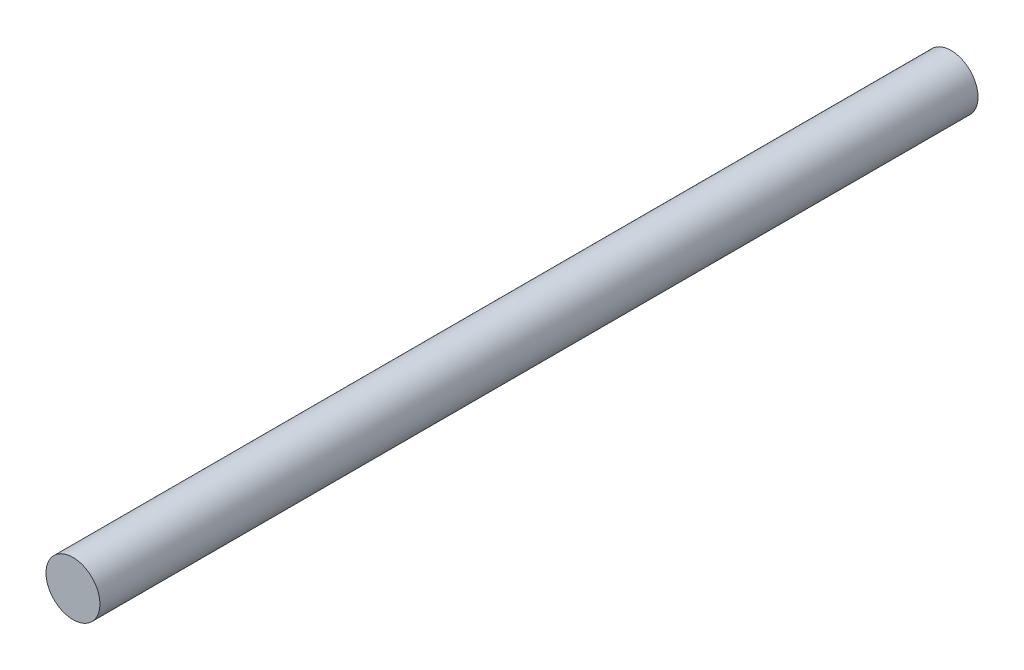
ISO-10303-21;
HEADER;
FILE_DESCRIPTION(('STEP AP214'),'2;1');
FILE_NAME('part.step','',(''),(''),'','','');
FILE_SCHEMA(('AUTOMOTIVE_DESIGN { 1 0 10303 214 1 1 1 1 }'));
ENDSEC;
DATA;
#1=APPLICATION_CONTEXT('core data for automotive mechanical design processes');
#2=APPLICATION_PROTOCOL_DEFINITION('international standard','automotive_design',2000,#1);
#3=PRODUCT_CONTEXT('',#1,'mechanical');
#4=PRODUCT('Part','Part','',(#3));
#5=PRODUCT_RELATED_PRODUCT_CATEGORY('part','',(#4));
#6=PRODUCT_DEFINITION_FORMATION('','',#4);
#7=PRODUCT_DEFINITION_CONTEXT('part definition',#1,'design');
#8=PRODUCT_DEFINITION('design','',#6,#7);
#9=PRODUCT_DEFINITION_SHAPE('','',#8);
#10=(LENGTH_UNIT() NAMED_UNIT(*) SI_UNIT(.MILLI.,.METRE.));
#11=(NAMED_UNIT(*) PLANE_ANGLE_UNIT() SI_UNIT($,.RADIAN.));
#12=(NAMED_UNIT(*) SI_UNIT($,.STERADIAN.) SOLID_ANGLE_UNIT());
#13=UNCERTAINTY_MEASURE_WITH_UNIT(LENGTH_MEASURE(1.E-05),#10,'distance_accuracy_value','');
#14=(GEOMETRIC_REPRESENTATION_CONTEXT(3) GLOBAL_UNCERTAINTY_ASSIGNED_CONTEXT((#13)) GLOBAL_UNIT_ASSIGNED_CONTEXT((#10,
#11,#12)) REPRESENTATION_CONTEXT('',''));
#15=CARTESIAN_POINT('',(0.,0.,0.));
#16=DIRECTION('',(0.,0.,1.));
#17=DIRECTION('',(1.,0.,0.));
#18=AXIS2_PLACEMENT_3D('',#15,#16,#17);
#19=CARTESIAN_POINT('',(0.,0.,114.));
#20=DIRECTION('',(0.,0.,-1.));
#21=DIRECTION('',(-1.,0.,0.));
#22=AXIS2_PLACEMENT_3D('',#19,#20,#21);
#23=CYLINDRICAL_SURFACE('',#22,3.5);
#24=CARTESIAN_POINT('',(0.,0.,114.));
#25=DIRECTION('',(0.,0.,1.));
#26=DIRECTION('',(1.,0.,0.));
#27=AXIS2_PLACEMENT_3D('',#24,#25,#26);
#28=CIRCLE('',#27,3.5);
#29=CARTESIAN_POINT('',(-3.5,0.,114.));
#30=VERTEX_POINT('',#29);
#31=EDGE_CURVE('E10',#30,#30,#28,.T.);
#32=CARTESIAN_POINT('',(0.,0.,0.));
#33=DIRECTION('',(0.,0.,1.));
#34=DIRECTION('',(1.,0.,0.));
#35=AXIS2_PLACEMENT_3D('',#32,#33,#34);
#36=CIRCLE('',#35,3.5);
#37=CARTESIAN_POINT('',(-3.5,0.,0.));
#38=VERTEX_POINT('',#37);
#39=EDGE_CURVE('E33',#38,#38,#36,.T.);
#40=CARTESIAN_POINT('',(-3.5,0.,114.));
#41=CARTESIAN_POINT('',(-3.5,0.,112.8125));
#42=CARTESIAN_POINT('',(-3.5,0.,111.625));
#43=CARTESIAN_POINT('',(-3.5,0.,109.25));
#44=CARTESIAN_POINT('',(-3.5,0.,108.0625));
#45=CARTESIAN_POINT('',(-3.5,0.,105.6875));
#46=CARTESIAN_POINT('',(-3.5,0.,104.5));
#47=CARTESIAN_POINT('',(-3.5,0.,102.125));
#48=CARTESIAN_POINT('',(-3.5,0.,100.9375));
#49=CARTESIAN_POINT('',(-3.5,0.,98.5625));
#50=CARTESIAN_POINT('',(-3.5,0.,97.375));
#51=CARTESIAN_POINT('',(-3.5,0.,95.));
#52=CARTESIAN_POINT('',(-3.5,0.,93.8125));
#53=CARTESIAN_POINT('',(-3.5,0.,91.4375));
#54=CARTESIAN_POINT('',(-3.5,0.,90.25));
#55=CARTESIAN_POINT('',(-3.5,0.,87.875));
#56=CARTESIAN_POINT('',(-3.5,0.,86.6875));
#57=CARTESIAN_POINT('',(-3.5,0.,84.3125));
#58=CARTESIAN_POINT('',(-3.5,0.,83.125));
#59=CARTESIAN_POINT('',(-3.5,0.,80.75));
#60=CARTESIAN_POINT('',(-3.5,0.,79.5625));
#61=CARTESIAN_POINT('',(-3.5,0.,77.1875));
#62=CARTESIAN_POINT('',(-3.5,0.,76.));
#63=CARTESIAN_POINT('',(-3.5,0.,73.625));
#64=CARTESIAN_POINT('',(-3.5,0.,72.4375));
#65=CARTESIAN_POINT('',(-3.5,0.,70.0625));
#66=CARTESIAN_POINT('',(-3.5,0.,68.875));
#67=CARTESIAN_POINT('',(-3.5,0.,66.5));
#68=CARTESIAN_POINT('',(-3.5,0.,65.3125));
#69=CARTESIAN_POINT('',(-3.5,0.,62.9375));
#70=CARTESIAN_POINT('',(-3.5,0.,61.75));
#71=CARTESIAN_POINT('',(-3.5,0.,59.375));
#72=CARTESIAN_POINT('',(-3.5,0.,58.1875));
#73=CARTESIAN_POINT('',(-3.5,0.,55.8125));
#74=CARTESIAN_POINT('',(-3.5,0.,54.625));
#75=CARTESIAN_POINT('',(-3.5,0.,52.25));
#76=CARTESIAN_POINT('',(-3.5,0.,51.0625));
#77=CARTESIAN_POINT('',(-3.5,0.,48.6875));
#78=CARTESIAN_POINT('',(-3.5,0.,47.5));
#79=CARTESIAN_POINT('',(-3.5,0.,45.125));
#80=CARTESIAN_POINT('',(-3.5,0.,43.9375));
#81=CARTESIAN_POINT('',(-3.5,0.,41.5625));
#82=CARTESIAN_POINT('',(-3.5,0.,40.375));
#83=CARTESIAN_POINT('',(-3.5,0.,38.));
#84=CARTESIAN_POINT('',(-3.5,0.,36.8125));
#85=CARTESIAN_POINT('',(-3.5,0.,34.4375));
#86=CARTESIAN_POINT('',(-3.5,0.,33.25));
#87=CARTESIAN_POINT('',(-3.5,0.,30.875));
#88=CARTESIAN_POINT('',(-3.5,0.,29.6875));
#89=CARTESIAN_POINT('',(-3.5,0.,27.3125));
#90=CARTESIAN_POINT('',(-3.5,0.,26.125));
#91=CARTESIAN_POINT('',(-3.5,0.,23.75));
#92=CARTESIAN_POINT('',(-3.5,0.,22.5625));
#93=CARTESIAN_POINT('',(-3.5,0.,20.1875));
#94=CARTESIAN_POINT('',(-3.5,0.,19.));
#95=CARTESIAN_POINT('',(-3.5,0.,16.625));
#96=CARTESIAN_POINT('',(-3.5,0.,15.4375));
#97=CARTESIAN_POINT('',(-3.5,0.,13.0625));
#98=CARTESIAN_POINT('',(-3.5,0.,11.875));
#99=CARTESIAN_POINT('',(-3.5,0.,9.5));
#100=CARTESIAN_POINT('',(-3.5,0.,8.31250000000001));
#101=CARTESIAN_POINT('',(-3.5,0.,5.9375));
#102=CARTESIAN_POINT('',(-3.5,0.,4.75));
#103=CARTESIAN_POINT('',(-3.5,0.,2.375));
#104=CARTESIAN_POINT('',(-3.5,0.,1.1875));
#105=CARTESIAN_POINT('',(-3.5,0.,0.));
#106=B_SPLINE_CURVE_WITH_KNOTS('',3,(#40,#41,#42,#43,#44,#45,#46,#47,#48,#49,#50,#51,#52,#53,
#54,#55,#56,#57,#58,#59,#60,#61,#62,#63,#64,#65,#66,#67,#68,#69,#70,#71,#72,#73,#74,#75,#76,#77,
#78,#79,#80,#81,#82,#83,#84,#85,#86,#87,#88,#89,#90,#91,#92,#93,#94,#95,#96,#97,#98,#99,#100,
#101,#102,#103,#104,#105),.UNSPECIFIED.,.F.,.F.,(4,2,2,2,2,2,2,2,2,2,2,2,2,2,2,2,2,2,2,2,2,2,2,
2,2,2,2,2,2,2,2,2,4),(0.,3.5625,7.12499999999999,10.6875,14.25,17.8125,21.375,24.9375,28.5,
32.0625,35.625,39.1875,42.75,46.3125,49.875,53.4375,57.,60.5625,64.125,67.6875,71.25,74.8125,
78.375,81.9375,85.5,89.0625,92.625,96.1875,99.75,103.3125,106.875,110.4375,114.),.UNSPECIFIED.);
#107=EDGE_CURVE('BSEAM30',#30,#38,#106,.T.);
#108=ORIENTED_EDGE('',*,*,#31,.F.);
#109=ORIENTED_EDGE('',*,*,#39,.T.);
#110=ORIENTED_EDGE('',*,*,#107,.T.);
#111=ORIENTED_EDGE('',*,*,#107,.F.);
#112=EDGE_LOOP('',(#108,#110,#109,#111));
#113=FACE_BOUND('',#112,.T.);
#114=ADVANCED_FACE('F30',(#113),#23,.T.);
#115=CARTESIAN_POINT('',(0.,0.,114.));
#116=DIRECTION('',(0.,0.,1.));
#117=DIRECTION('',(1.,0.,0.));
#118=AXIS2_PLACEMENT_3D('',#115,#116,#117);
#119=PLANE('',#118);
#120=ORIENTED_EDGE('',*,*,#31,.T.);
#121=EDGE_LOOP('',(#120));
#122=FACE_BOUND('',#121,.T.);
#123=ADVANCED_FACE('F45',(#122),#119,.T.);
#124=CARTESIAN_POINT('',(0.,0.,0.));
#125=DIRECTION('',(0.,0.,1.));
#126=DIRECTION('',(1.,0.,0.));
#127=AXIS2_PLACEMENT_3D('',#124,#125,#126);
#128=PLANE('',#127);
#129=ORIENTED_EDGE('',*,*,#39,.F.);
#130=EDGE_LOOP('',(#129));
#131=FACE_BOUND('',#130,.T.);
#132=ADVANCED_FACE('F43',(#131),#128,.F.);
#133=CLOSED_SHELL('',(#114,#123,#132));
#134=MANIFOLD_SOLID_BREP('B2',#133);
#135=ADVANCED_BREP_SHAPE_REPRESENTATION('',(#18,#134),#14);
#136=SHAPE_DEFINITION_REPRESENTATION(#9,#135);
ENDSEC;
END-ISO-10303-21;
